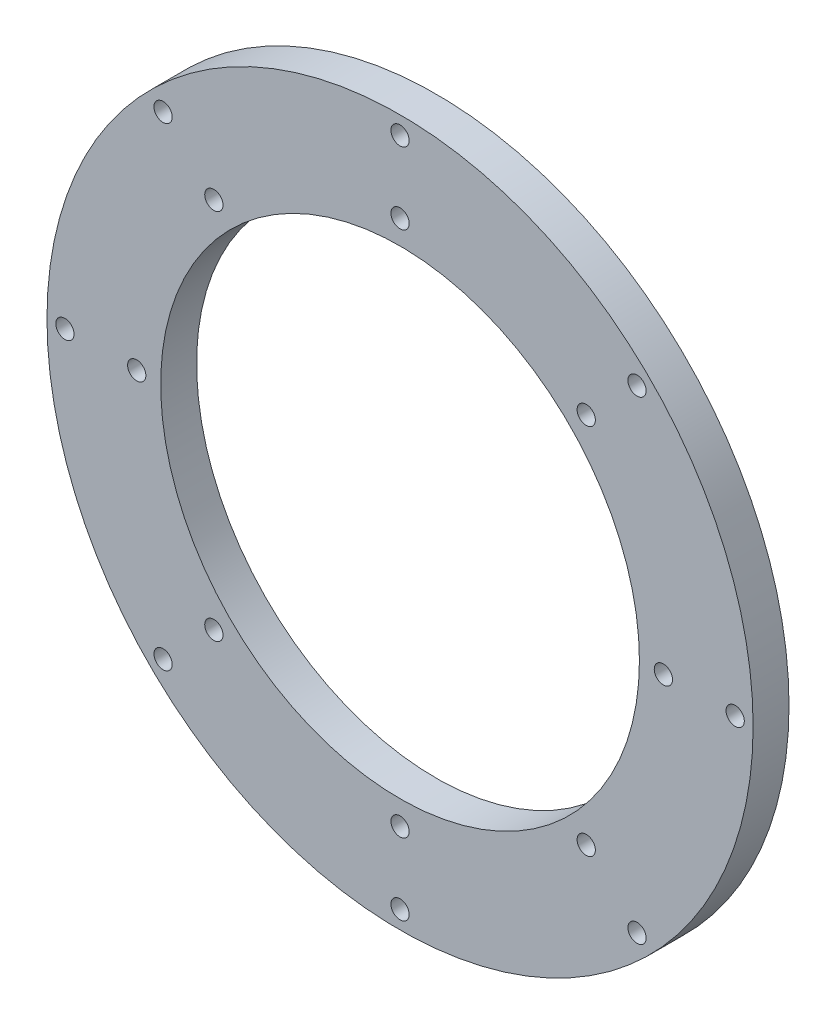
ISO-10303-21;
HEADER;
FILE_DESCRIPTION(('STEP AP214'),'2;1');
FILE_NAME('part.step','',(''),(''),'','','');
FILE_SCHEMA(('AUTOMOTIVE_DESIGN { 1 0 10303 214 1 1 1 1 }'));
ENDSEC;
DATA;
#1=APPLICATION_CONTEXT('core data for automotive mechanical design processes');
#2=APPLICATION_PROTOCOL_DEFINITION('international standard','automotive_design',2000,#1);
#3=PRODUCT_CONTEXT('',#1,'mechanical');
#4=PRODUCT('Part','Part','',(#3));
#5=PRODUCT_RELATED_PRODUCT_CATEGORY('part','',(#4));
#6=PRODUCT_DEFINITION_FORMATION('','',#4);
#7=PRODUCT_DEFINITION_CONTEXT('part definition',#1,'design');
#8=PRODUCT_DEFINITION('design','',#6,#7);
#9=PRODUCT_DEFINITION_SHAPE('','',#8);
#10=(LENGTH_UNIT() NAMED_UNIT(*) SI_UNIT(.MILLI.,.METRE.));
#11=(NAMED_UNIT(*) PLANE_ANGLE_UNIT() SI_UNIT($,.RADIAN.));
#12=(NAMED_UNIT(*) SI_UNIT($,.STERADIAN.) SOLID_ANGLE_UNIT());
#13=UNCERTAINTY_MEASURE_WITH_UNIT(LENGTH_MEASURE(1.E-05),#10,'distance_accuracy_value','');
#14=(GEOMETRIC_REPRESENTATION_CONTEXT(3) GLOBAL_UNCERTAINTY_ASSIGNED_CONTEXT((#13)) GLOBAL_UNIT_ASSIGNED_CONTEXT((#10,
#11,#12)) REPRESENTATION_CONTEXT('',''));
#15=CARTESIAN_POINT('',(0.,0.,0.));
#16=DIRECTION('',(0.,0.,1.));
#17=DIRECTION('',(1.,0.,0.));
#18=AXIS2_PLACEMENT_3D('',#15,#16,#17);
#19=CARTESIAN_POINT('',(0.,0.,0.));
#20=DIRECTION('',(0.,0.,1.));
#21=DIRECTION('',(1.,0.,0.));
#22=AXIS2_PLACEMENT_3D('',#19,#20,#21);
#23=PLANE('',#22);
#24=CARTESIAN_POINT('',(-31.1126983722077,31.1126983722085,0.));
#25=DIRECTION('',(0.,0.,-1.));
#26=DIRECTION('',(-1.,0.,0.));
#27=AXIS2_PLACEMENT_3D('',#24,#25,#26);
#28=CIRCLE('',#27,3.3);
#29=CARTESIAN_POINT('',(-34.4126983722077,31.1126983722085,0.));
#30=VERTEX_POINT('',#29);
#31=EDGE_CURVE('E169',#30,#30,#28,.T.);
#32=ORIENTED_EDGE('',*,*,#31,.F.);
#33=EDGE_LOOP('',(#32));
#34=FACE_BOUND('',#33,.T.);
#35=CARTESIAN_POINT('',(-44.,4.60875536727294E-13,0.));
#36=DIRECTION('',(0.,0.,-1.));
#37=DIRECTION('',(-1.,0.,0.));
#38=AXIS2_PLACEMENT_3D('',#35,#36,#37);
#39=CIRCLE('',#38,3.3);
#40=CARTESIAN_POINT('',(-47.3,4.60875536727294E-13,0.));
#41=VERTEX_POINT('',#40);
#42=EDGE_CURVE('E163',#41,#41,#39,.T.);
#43=ORIENTED_EDGE('',*,*,#42,.F.);
#44=EDGE_LOOP('',(#43));
#45=FACE_BOUND('',#44,.T.);
#46=CARTESIAN_POINT('',(0.,44.,0.));
#47=DIRECTION('',(0.,0.,-1.));
#48=DIRECTION('',(-1.,0.,0.));
#49=AXIS2_PLACEMENT_3D('',#46,#47,#48);
#50=CIRCLE('',#49,3.3);
#51=CARTESIAN_POINT('',(-3.3,44.,0.));
#52=VERTEX_POINT('',#51);
#53=EDGE_CURVE('E127',#52,#52,#50,.T.);
#54=ORIENTED_EDGE('',*,*,#53,.F.);
#55=EDGE_LOOP('',(#54));
#56=FACE_BOUND('',#55,.T.);
#57=CARTESIAN_POINT('',(0.,56.,0.));
#58=DIRECTION('',(0.,0.,1.));
#59=DIRECTION('',(1.,0.,0.));
#60=AXIS2_PLACEMENT_3D('',#57,#58,#59);
#61=CIRCLE('',#60,1.525);
#62=CARTESIAN_POINT('',(1.525,56.,0.));
#63=VERTEX_POINT('',#62);
#64=EDGE_CURVE('E45',#63,#63,#61,.T.);
#65=ORIENTED_EDGE('',*,*,#64,.T.);
#66=EDGE_LOOP('',(#65));
#67=FACE_BOUND('',#66,.T.);
#68=CARTESIAN_POINT('',(39.5979797464467,39.5979797464467,0.));
#69=DIRECTION('',(0.,0.,1.));
#70=DIRECTION('',(1.,0.,0.));
#71=AXIS2_PLACEMENT_3D('',#68,#69,#70);
#72=CIRCLE('',#71,1.525);
#73=CARTESIAN_POINT('',(41.1229797464467,39.5979797464467,0.));
#74=VERTEX_POINT('',#73);
#75=EDGE_CURVE('E87',#74,#74,#72,.T.);
#76=ORIENTED_EDGE('',*,*,#75,.T.);
#77=EDGE_LOOP('',(#76));
#78=FACE_BOUND('',#77,.T.);
#79=CARTESIAN_POINT('',(56.,0.,0.));
#80=DIRECTION('',(0.,0.,1.));
#81=DIRECTION('',(1.,0.,0.));
#82=AXIS2_PLACEMENT_3D('',#79,#80,#81);
#83=CIRCLE('',#82,1.525);
#84=CARTESIAN_POINT('',(57.525,0.,0.));
#85=VERTEX_POINT('',#84);
#86=EDGE_CURVE('E81',#85,#85,#83,.T.);
#87=ORIENTED_EDGE('',*,*,#86,.T.);
#88=EDGE_LOOP('',(#87));
#89=FACE_BOUND('',#88,.T.);
#90=CARTESIAN_POINT('',(39.5979797464467,-39.5979797464467,0.));
#91=DIRECTION('',(0.,0.,1.));
#92=DIRECTION('',(1.,0.,0.));
#93=AXIS2_PLACEMENT_3D('',#90,#91,#92);
#94=CIRCLE('',#93,1.525);
#95=CARTESIAN_POINT('',(41.1229797464467,-39.5979797464467,0.));
#96=VERTEX_POINT('',#95);
#97=EDGE_CURVE('E75',#96,#96,#94,.T.);
#98=ORIENTED_EDGE('',*,*,#97,.T.);
#99=EDGE_LOOP('',(#98));
#100=FACE_BOUND('',#99,.T.);
#101=CARTESIAN_POINT('',(0.,-56.,0.));
#102=DIRECTION('',(0.,0.,1.));
#103=DIRECTION('',(1.,0.,0.));
#104=AXIS2_PLACEMENT_3D('',#101,#102,#103);
#105=CIRCLE('',#104,1.525);
#106=CARTESIAN_POINT('',(1.52500000000001,-56.,0.));
#107=VERTEX_POINT('',#106);
#108=EDGE_CURVE('E69',#107,#107,#105,.T.);
#109=ORIENTED_EDGE('',*,*,#108,.T.);
#110=EDGE_LOOP('',(#109));
#111=FACE_BOUND('',#110,.T.);
#112=CARTESIAN_POINT('',(-39.5979797464467,-39.5979797464467,0.));
#113=DIRECTION('',(0.,0.,1.));
#114=DIRECTION('',(1.,0.,0.));
#115=AXIS2_PLACEMENT_3D('',#112,#113,#114);
#116=CIRCLE('',#115,1.52499999999999);
#117=CARTESIAN_POINT('',(-38.0729797464467,-39.5979797464467,0.));
#118=VERTEX_POINT('',#117);
#119=EDGE_CURVE('E63',#118,#118,#116,.T.);
#120=ORIENTED_EDGE('',*,*,#119,.T.);
#121=EDGE_LOOP('',(#120));
#122=FACE_BOUND('',#121,.T.);
#123=CARTESIAN_POINT('',(-56.,0.,0.));
#124=DIRECTION('',(0.,0.,1.));
#125=DIRECTION('',(1.,0.,0.));
#126=AXIS2_PLACEMENT_3D('',#123,#124,#125);
#127=CIRCLE('',#126,1.525);
#128=CARTESIAN_POINT('',(-54.475,0.,0.));
#129=VERTEX_POINT('',#128);
#130=EDGE_CURVE('E57',#129,#129,#127,.T.);
#131=ORIENTED_EDGE('',*,*,#130,.T.);
#132=EDGE_LOOP('',(#131));
#133=FACE_BOUND('',#132,.T.);
#134=CARTESIAN_POINT('',(-39.5979797464467,39.5979797464467,0.));
#135=DIRECTION('',(0.,0.,1.));
#136=DIRECTION('',(1.,0.,0.));
#137=AXIS2_PLACEMENT_3D('',#134,#135,#136);
#138=CIRCLE('',#137,1.525);
#139=CARTESIAN_POINT('',(-38.0729797464467,39.5979797464467,0.));
#140=VERTEX_POINT('',#139);
#141=EDGE_CURVE('E50',#140,#140,#138,.T.);
#142=ORIENTED_EDGE('',*,*,#141,.T.);
#143=EDGE_LOOP('',(#142));
#144=FACE_BOUND('',#143,.T.);
#145=CARTESIAN_POINT('',(0.,0.,0.));
#146=DIRECTION('',(0.,0.,1.));
#147=DIRECTION('',(1.,0.,0.));
#148=AXIS2_PLACEMENT_3D('',#145,#146,#147);
#149=CIRCLE('',#148,59.);
#150=CARTESIAN_POINT('',(59.,0.,0.));
#151=VERTEX_POINT('',#150);
#152=EDGE_CURVE('E38',#151,#151,#149,.T.);
#153=ORIENTED_EDGE('',*,*,#152,.F.);
#154=EDGE_LOOP('',(#153));
#155=FACE_BOUND('',#154,.T.);
#156=CARTESIAN_POINT('',(0.,0.,0.));
#157=DIRECTION('',(0.,0.,1.));
#158=DIRECTION('',(1.,0.,0.));
#159=AXIS2_PLACEMENT_3D('',#156,#157,#158);
#160=CIRCLE('',#159,40.);
#161=CARTESIAN_POINT('',(40.,0.,0.));
#162=VERTEX_POINT('',#161);
#163=EDGE_CURVE('E51',#162,#162,#160,.F.);
#164=ORIENTED_EDGE('',*,*,#163,.F.);
#165=EDGE_LOOP('',(#164));
#166=FACE_BOUND('',#165,.T.);
#167=CARTESIAN_POINT('',(31.1126983722081,31.112698372208,0.));
#168=DIRECTION('',(0.,0.,-1.));
#169=DIRECTION('',(-1.,0.,0.));
#170=AXIS2_PLACEMENT_3D('',#167,#168,#169);
#171=CIRCLE('',#170,3.3);
#172=CARTESIAN_POINT('',(27.8126983722081,31.112698372208,0.));
#173=VERTEX_POINT('',#172);
#174=EDGE_CURVE('E133',#173,#173,#171,.T.);
#175=ORIENTED_EDGE('',*,*,#174,.F.);
#176=EDGE_LOOP('',(#175));
#177=FACE_BOUND('',#176,.T.);
#178=CARTESIAN_POINT('',(44.,-1.53625178909098E-13,0.));
#179=DIRECTION('',(0.,0.,-1.));
#180=DIRECTION('',(-1.,0.,0.));
#181=AXIS2_PLACEMENT_3D('',#178,#179,#180);
#182=CIRCLE('',#181,3.3);
#183=CARTESIAN_POINT('',(40.7,-1.53625178909098E-13,0.));
#184=VERTEX_POINT('',#183);
#185=EDGE_CURVE('E139',#184,#184,#182,.T.);
#186=ORIENTED_EDGE('',*,*,#185,.F.);
#187=EDGE_LOOP('',(#186));
#188=FACE_BOUND('',#187,.T.);
#189=CARTESIAN_POINT('',(31.1126983722079,-31.1126983722082,0.));
#190=DIRECTION('',(0.,0.,-1.));
#191=DIRECTION('',(-1.,0.,0.));
#192=AXIS2_PLACEMENT_3D('',#189,#190,#191);
#193=CIRCLE('',#192,3.3);
#194=CARTESIAN_POINT('',(27.8126983722079,-31.1126983722082,0.));
#195=VERTEX_POINT('',#194);
#196=EDGE_CURVE('E145',#195,#195,#193,.T.);
#197=ORIENTED_EDGE('',*,*,#196,.F.);
#198=EDGE_LOOP('',(#197));
#199=FACE_BOUND('',#198,.T.);
#200=CARTESIAN_POINT('',(0.,-44.,0.));
#201=DIRECTION('',(0.,0.,-1.));
#202=DIRECTION('',(-1.,0.,0.));
#203=AXIS2_PLACEMENT_3D('',#200,#201,#202);
#204=CIRCLE('',#203,3.3);
#205=CARTESIAN_POINT('',(-3.3,-44.,0.));
#206=VERTEX_POINT('',#205);
#207=EDGE_CURVE('E151',#206,#206,#204,.T.);
#208=ORIENTED_EDGE('',*,*,#207,.F.);
#209=EDGE_LOOP('',(#208));
#210=FACE_BOUND('',#209,.T.);
#211=CARTESIAN_POINT('',(-31.1126983722084,-31.1126983722078,0.));
#212=DIRECTION('',(0.,0.,-1.));
#213=DIRECTION('',(-1.,0.,0.));
#214=AXIS2_PLACEMENT_3D('',#211,#212,#213);
#215=CIRCLE('',#214,3.3);
#216=CARTESIAN_POINT('',(-34.4126983722084,-31.1126983722078,0.));
#217=VERTEX_POINT('',#216);
#218=EDGE_CURVE('E157',#217,#217,#215,.T.);
#219=ORIENTED_EDGE('',*,*,#218,.F.);
#220=EDGE_LOOP('',(#219));
#221=FACE_BOUND('',#220,.T.);
#222=ADVANCED_FACE('F34',(#34,#45,#56,#67,#78,#89,#100,#111,#122,#133,#144,#155,#166,#177,#188,
#199,#210,#221),#23,.F.);
#223=CARTESIAN_POINT('',(0.,0.,6.));
#224=DIRECTION('',(0.,0.,1.));
#225=DIRECTION('',(1.,0.,0.));
#226=AXIS2_PLACEMENT_3D('',#223,#224,#225);
#227=PLANE('',#226);
#228=CARTESIAN_POINT('',(0.,44.,6.));
#229=DIRECTION('',(0.,0.,1.));
#230=DIRECTION('',(1.,0.,0.));
#231=AXIS2_PLACEMENT_3D('',#228,#229,#230);
#232=CIRCLE('',#231,1.525);
#233=CARTESIAN_POINT('',(1.525,44.,6.));
#234=VERTEX_POINT('',#233);
#235=EDGE_CURVE('E100',#234,#234,#232,.F.);
#236=ORIENTED_EDGE('',*,*,#235,.T.);
#237=EDGE_LOOP('',(#236));
#238=FACE_BOUND('',#237,.T.);
#239=CARTESIAN_POINT('',(-31.1126983722081,31.1126983722081,6.));
#240=DIRECTION('',(0.,0.,1.));
#241=DIRECTION('',(1.,0.,0.));
#242=AXIS2_PLACEMENT_3D('',#239,#240,#241);
#243=CIRCLE('',#242,1.52499999999999);
#244=CARTESIAN_POINT('',(-29.5876983722081,31.1126983722081,6.));
#245=VERTEX_POINT('',#244);
#246=EDGE_CURVE('E120',#245,#245,#243,.F.);
#247=ORIENTED_EDGE('',*,*,#246,.T.);
#248=EDGE_LOOP('',(#247));
#249=FACE_BOUND('',#248,.T.);
#250=CARTESIAN_POINT('',(-44.,0.,6.));
#251=DIRECTION('',(0.,0.,1.));
#252=DIRECTION('',(1.,0.,0.));
#253=AXIS2_PLACEMENT_3D('',#250,#251,#252);
#254=CIRCLE('',#253,1.525);
#255=CARTESIAN_POINT('',(-42.475,0.,6.));
#256=VERTEX_POINT('',#255);
#257=EDGE_CURVE('E117',#256,#256,#254,.F.);
#258=ORIENTED_EDGE('',*,*,#257,.T.);
#259=EDGE_LOOP('',(#258));
#260=FACE_BOUND('',#259,.T.);
#261=CARTESIAN_POINT('',(-31.1126983722081,-31.1126983722081,6.));
#262=DIRECTION('',(0.,0.,1.));
#263=DIRECTION('',(1.,0.,0.));
#264=AXIS2_PLACEMENT_3D('',#261,#262,#263);
#265=CIRCLE('',#264,1.525);
#266=CARTESIAN_POINT('',(-29.5876983722081,-31.1126983722081,6.));
#267=VERTEX_POINT('',#266);
#268=EDGE_CURVE('E114',#267,#267,#265,.F.);
#269=ORIENTED_EDGE('',*,*,#268,.T.);
#270=EDGE_LOOP('',(#269));
#271=FACE_BOUND('',#270,.T.);
#272=CARTESIAN_POINT('',(0.,-44.,6.));
#273=DIRECTION('',(0.,0.,1.));
#274=DIRECTION('',(1.,0.,0.));
#275=AXIS2_PLACEMENT_3D('',#272,#273,#274);
#276=CIRCLE('',#275,1.525);
#277=CARTESIAN_POINT('',(1.52499999999999,-44.,6.));
#278=VERTEX_POINT('',#277);
#279=EDGE_CURVE('E111',#278,#278,#276,.F.);
#280=ORIENTED_EDGE('',*,*,#279,.T.);
#281=EDGE_LOOP('',(#280));
#282=FACE_BOUND('',#281,.T.);
#283=CARTESIAN_POINT('',(31.1126983722081,-31.1126983722081,6.));
#284=DIRECTION('',(0.,0.,1.));
#285=DIRECTION('',(1.,0.,0.));
#286=AXIS2_PLACEMENT_3D('',#283,#284,#285);
#287=CIRCLE('',#286,1.525);
#288=CARTESIAN_POINT('',(32.6376983722081,-31.1126983722081,6.));
#289=VERTEX_POINT('',#288);
#290=EDGE_CURVE('E108',#289,#289,#287,.F.);
#291=ORIENTED_EDGE('',*,*,#290,.T.);
#292=EDGE_LOOP('',(#291));
#293=FACE_BOUND('',#292,.T.);
#294=CARTESIAN_POINT('',(44.,0.,6.));
#295=DIRECTION('',(0.,0.,1.));
#296=DIRECTION('',(1.,0.,0.));
#297=AXIS2_PLACEMENT_3D('',#294,#295,#296);
#298=CIRCLE('',#297,1.525);
#299=CARTESIAN_POINT('',(45.525,0.,6.));
#300=VERTEX_POINT('',#299);
#301=EDGE_CURVE('E104',#300,#300,#298,.F.);
#302=ORIENTED_EDGE('',*,*,#301,.T.);
#303=EDGE_LOOP('',(#302));
#304=FACE_BOUND('',#303,.T.);
#305=CARTESIAN_POINT('',(31.1126983722081,31.1126983722081,6.));
#306=DIRECTION('',(0.,0.,1.));
#307=DIRECTION('',(1.,0.,0.));
#308=AXIS2_PLACEMENT_3D('',#305,#306,#307);
#309=CIRCLE('',#308,1.525);
#310=CARTESIAN_POINT('',(32.6376983722081,31.1126983722081,6.));
#311=VERTEX_POINT('',#310);
#312=EDGE_CURVE('E101',#311,#311,#309,.F.);
#313=ORIENTED_EDGE('',*,*,#312,.T.);
#314=EDGE_LOOP('',(#313));
#315=FACE_BOUND('',#314,.T.);
#316=CARTESIAN_POINT('',(0.,56.,6.));
#317=DIRECTION('',(0.,0.,1.));
#318=DIRECTION('',(1.,0.,0.));
#319=AXIS2_PLACEMENT_3D('',#316,#317,#318);
#320=CIRCLE('',#319,1.525);
#321=CARTESIAN_POINT('',(1.525,56.,6.));
#322=VERTEX_POINT('',#321);
#323=EDGE_CURVE('E90',#322,#322,#320,.T.);
#324=ORIENTED_EDGE('',*,*,#323,.F.);
#325=EDGE_LOOP('',(#324));
#326=FACE_BOUND('',#325,.T.);
#327=CARTESIAN_POINT('',(39.5979797464467,39.5979797464467,6.));
#328=DIRECTION('',(0.,0.,1.));
#329=DIRECTION('',(1.,0.,0.));
#330=AXIS2_PLACEMENT_3D('',#327,#328,#329);
#331=CIRCLE('',#330,1.525);
#332=CARTESIAN_POINT('',(41.1229797464467,39.5979797464467,6.));
#333=VERTEX_POINT('',#332);
#334=EDGE_CURVE('E84',#333,#333,#331,.T.);
#335=ORIENTED_EDGE('',*,*,#334,.F.);
#336=EDGE_LOOP('',(#335));
#337=FACE_BOUND('',#336,.T.);
#338=CARTESIAN_POINT('',(56.,0.,6.));
#339=DIRECTION('',(0.,0.,1.));
#340=DIRECTION('',(1.,0.,0.));
#341=AXIS2_PLACEMENT_3D('',#338,#339,#340);
#342=CIRCLE('',#341,1.525);
#343=CARTESIAN_POINT('',(57.525,0.,6.));
#344=VERTEX_POINT('',#343);
#345=EDGE_CURVE('E78',#344,#344,#342,.T.);
#346=ORIENTED_EDGE('',*,*,#345,.F.);
#347=EDGE_LOOP('',(#346));
#348=FACE_BOUND('',#347,.T.);
#349=CARTESIAN_POINT('',(39.5979797464467,-39.5979797464467,6.));
#350=DIRECTION('',(0.,0.,1.));
#351=DIRECTION('',(1.,0.,0.));
#352=AXIS2_PLACEMENT_3D('',#349,#350,#351);
#353=CIRCLE('',#352,1.525);
#354=CARTESIAN_POINT('',(41.1229797464467,-39.5979797464467,6.));
#355=VERTEX_POINT('',#354);
#356=EDGE_CURVE('E72',#355,#355,#353,.T.);
#357=ORIENTED_EDGE('',*,*,#356,.F.);
#358=EDGE_LOOP('',(#357));
#359=FACE_BOUND('',#358,.T.);
#360=CARTESIAN_POINT('',(0.,-56.,6.));
#361=DIRECTION('',(0.,0.,1.));
#362=DIRECTION('',(1.,0.,0.));
#363=AXIS2_PLACEMENT_3D('',#360,#361,#362);
#364=CIRCLE('',#363,1.525);
#365=CARTESIAN_POINT('',(1.52500000000001,-56.,6.));
#366=VERTEX_POINT('',#365);
#367=EDGE_CURVE('E66',#366,#366,#364,.T.);
#368=ORIENTED_EDGE('',*,*,#367,.F.);
#369=EDGE_LOOP('',(#368));
#370=FACE_BOUND('',#369,.T.);
#371=CARTESIAN_POINT('',(-39.5979797464467,-39.5979797464467,6.));
#372=DIRECTION('',(0.,0.,1.));
#373=DIRECTION('',(1.,0.,0.));
#374=AXIS2_PLACEMENT_3D('',#371,#372,#373);
#375=CIRCLE('',#374,1.52499999999999);
#376=CARTESIAN_POINT('',(-38.0729797464467,-39.5979797464467,6.));
#377=VERTEX_POINT('',#376);
#378=EDGE_CURVE('E60',#377,#377,#375,.T.);
#379=ORIENTED_EDGE('',*,*,#378,.F.);
#380=EDGE_LOOP('',(#379));
#381=FACE_BOUND('',#380,.T.);
#382=CARTESIAN_POINT('',(-56.,0.,6.));
#383=DIRECTION('',(0.,0.,1.));
#384=DIRECTION('',(1.,0.,0.));
#385=AXIS2_PLACEMENT_3D('',#382,#383,#384);
#386=CIRCLE('',#385,1.525);
#387=CARTESIAN_POINT('',(-54.475,0.,6.));
#388=VERTEX_POINT('',#387);
#389=EDGE_CURVE('E54',#388,#388,#386,.T.);
#390=ORIENTED_EDGE('',*,*,#389,.F.);
#391=EDGE_LOOP('',(#390));
#392=FACE_BOUND('',#391,.T.);
#393=CARTESIAN_POINT('',(-39.5979797464467,39.5979797464467,6.));
#394=DIRECTION('',(0.,0.,1.));
#395=DIRECTION('',(1.,0.,0.));
#396=AXIS2_PLACEMENT_3D('',#393,#394,#395);
#397=CIRCLE('',#396,1.525);
#398=CARTESIAN_POINT('',(-38.0729797464467,39.5979797464467,6.));
#399=VERTEX_POINT('',#398);
#400=EDGE_CURVE('E47',#399,#399,#397,.T.);
#401=ORIENTED_EDGE('',*,*,#400,.F.);
#402=EDGE_LOOP('',(#401));
#403=FACE_BOUND('',#402,.T.);
#404=CARTESIAN_POINT('',(0.,0.,6.));
#405=DIRECTION('',(0.,0.,1.));
#406=DIRECTION('',(1.,0.,0.));
#407=AXIS2_PLACEMENT_3D('',#404,#405,#406);
#408=CIRCLE('',#407,59.);
#409=CARTESIAN_POINT('',(59.,0.,6.));
#410=VERTEX_POINT('',#409);
#411=EDGE_CURVE('E10',#410,#410,#408,.T.);
#412=ORIENTED_EDGE('',*,*,#411,.T.);
#413=EDGE_LOOP('',(#412));
#414=FACE_BOUND('',#413,.T.);
#415=CARTESIAN_POINT('',(0.,0.,6.));
#416=DIRECTION('',(0.,0.,1.));
#417=DIRECTION('',(1.,0.,0.));
#418=AXIS2_PLACEMENT_3D('',#415,#416,#417);
#419=CIRCLE('',#418,40.);
#420=CARTESIAN_POINT('',(40.,0.,6.));
#421=VERTEX_POINT('',#420);
#422=EDGE_CURVE('E97',#421,#421,#419,.T.);
#423=ORIENTED_EDGE('',*,*,#422,.F.);
#424=EDGE_LOOP('',(#423));
#425=FACE_BOUND('',#424,.T.);
#426=ADVANCED_FACE('F177',(#238,#249,#260,#271,#282,#293,#304,#315,#326,#337,#348,#359,#370,
#381,#392,#403,#414,#425),#227,.T.);
#427=CARTESIAN_POINT('',(0.,0.,6.));
#428=DIRECTION('',(0.,0.,-1.));
#429=DIRECTION('',(-1.,0.,0.));
#430=AXIS2_PLACEMENT_3D('',#427,#428,#429);
#431=CYLINDRICAL_SURFACE('',#430,59.);
#432=ORIENTED_EDGE('',*,*,#411,.F.);
#433=EDGE_LOOP('',(#432));
#434=FACE_BOUND('',#433,.T.);
#435=ORIENTED_EDGE('',*,*,#152,.T.);
#436=EDGE_LOOP('',(#435));
#437=FACE_BOUND('',#436,.T.);
#438=ADVANCED_FACE('F36',(#434,#437),#431,.T.);
#439=CARTESIAN_POINT('',(-39.5979797464467,39.5979797464467,0.));
#440=DIRECTION('',(0.,0.,1.));
#441=DIRECTION('',(1.,0.,0.));
#442=AXIS2_PLACEMENT_3D('',#439,#440,#441);
#443=CYLINDRICAL_SURFACE('',#442,1.525);
#444=ORIENTED_EDGE('',*,*,#141,.F.);
#445=EDGE_LOOP('',(#444));
#446=FACE_BOUND('',#445,.T.);
#447=ORIENTED_EDGE('',*,*,#400,.T.);
#448=EDGE_LOOP('',(#447));
#449=FACE_BOUND('',#448,.T.);
#450=ADVANCED_FACE('F308',(#446,#449),#443,.F.);
#451=CARTESIAN_POINT('',(-56.,0.,0.));
#452=DIRECTION('',(0.,0.,1.));
#453=DIRECTION('',(1.,0.,0.));
#454=AXIS2_PLACEMENT_3D('',#451,#452,#453);
#455=CYLINDRICAL_SURFACE('',#454,1.525);
#456=ORIENTED_EDGE('',*,*,#130,.F.);
#457=EDGE_LOOP('',(#456));
#458=FACE_BOUND('',#457,.T.);
#459=ORIENTED_EDGE('',*,*,#389,.T.);
#460=EDGE_LOOP('',(#459));
#461=FACE_BOUND('',#460,.T.);
#462=ADVANCED_FACE('F304',(#458,#461),#455,.F.);
#463=CARTESIAN_POINT('',(-39.5979797464467,-39.5979797464467,0.));
#464=DIRECTION('',(0.,0.,1.));
#465=DIRECTION('',(1.,0.,0.));
#466=AXIS2_PLACEMENT_3D('',#463,#464,#465);
#467=CYLINDRICAL_SURFACE('',#466,1.52499999999999);
#468=ORIENTED_EDGE('',*,*,#119,.F.);
#469=EDGE_LOOP('',(#468));
#470=FACE_BOUND('',#469,.T.);
#471=ORIENTED_EDGE('',*,*,#378,.T.);
#472=EDGE_LOOP('',(#471));
#473=FACE_BOUND('',#472,.T.);
#474=ADVANCED_FACE('F300',(#470,#473),#467,.F.);
#475=CARTESIAN_POINT('',(0.,-56.,0.));
#476=DIRECTION('',(0.,0.,1.));
#477=DIRECTION('',(1.,0.,0.));
#478=AXIS2_PLACEMENT_3D('',#475,#476,#477);
#479=CYLINDRICAL_SURFACE('',#478,1.525);
#480=ORIENTED_EDGE('',*,*,#108,.F.);
#481=EDGE_LOOP('',(#480));
#482=FACE_BOUND('',#481,.T.);
#483=ORIENTED_EDGE('',*,*,#367,.T.);
#484=EDGE_LOOP('',(#483));
#485=FACE_BOUND('',#484,.T.);
#486=ADVANCED_FACE('F296',(#482,#485),#479,.F.);
#487=CARTESIAN_POINT('',(39.5979797464467,-39.5979797464467,0.));
#488=DIRECTION('',(0.,0.,1.));
#489=DIRECTION('',(1.,0.,0.));
#490=AXIS2_PLACEMENT_3D('',#487,#488,#489);
#491=CYLINDRICAL_SURFACE('',#490,1.525);
#492=ORIENTED_EDGE('',*,*,#97,.F.);
#493=EDGE_LOOP('',(#492));
#494=FACE_BOUND('',#493,.T.);
#495=ORIENTED_EDGE('',*,*,#356,.T.);
#496=EDGE_LOOP('',(#495));
#497=FACE_BOUND('',#496,.T.);
#498=ADVANCED_FACE('F292',(#494,#497),#491,.F.);
#499=CARTESIAN_POINT('',(56.,0.,0.));
#500=DIRECTION('',(0.,0.,1.));
#501=DIRECTION('',(1.,0.,0.));
#502=AXIS2_PLACEMENT_3D('',#499,#500,#501);
#503=CYLINDRICAL_SURFACE('',#502,1.525);
#504=ORIENTED_EDGE('',*,*,#86,.F.);
#505=EDGE_LOOP('',(#504));
#506=FACE_BOUND('',#505,.T.);
#507=ORIENTED_EDGE('',*,*,#345,.T.);
#508=EDGE_LOOP('',(#507));
#509=FACE_BOUND('',#508,.T.);
#510=ADVANCED_FACE('F288',(#506,#509),#503,.F.);
#511=CARTESIAN_POINT('',(39.5979797464467,39.5979797464467,0.));
#512=DIRECTION('',(0.,0.,1.));
#513=DIRECTION('',(1.,0.,0.));
#514=AXIS2_PLACEMENT_3D('',#511,#512,#513);
#515=CYLINDRICAL_SURFACE('',#514,1.525);
#516=ORIENTED_EDGE('',*,*,#75,.F.);
#517=EDGE_LOOP('',(#516));
#518=FACE_BOUND('',#517,.T.);
#519=ORIENTED_EDGE('',*,*,#334,.T.);
#520=EDGE_LOOP('',(#519));
#521=FACE_BOUND('',#520,.T.);
#522=ADVANCED_FACE('F284',(#518,#521),#515,.F.);
#523=CARTESIAN_POINT('',(0.,56.,0.));
#524=DIRECTION('',(0.,0.,1.));
#525=DIRECTION('',(1.,0.,0.));
#526=AXIS2_PLACEMENT_3D('',#523,#524,#525);
#527=CYLINDRICAL_SURFACE('',#526,1.525);
#528=ORIENTED_EDGE('',*,*,#64,.F.);
#529=EDGE_LOOP('',(#528));
#530=FACE_BOUND('',#529,.T.);
#531=ORIENTED_EDGE('',*,*,#323,.T.);
#532=EDGE_LOOP('',(#531));
#533=FACE_BOUND('',#532,.T.);
#534=ADVANCED_FACE('F280',(#530,#533),#527,.F.);
#535=CARTESIAN_POINT('',(0.,0.,-142.835569799683));
#536=DIRECTION('',(0.,0.,1.));
#537=DIRECTION('',(1.,0.,0.));
#538=AXIS2_PLACEMENT_3D('',#535,#536,#537);
#539=CYLINDRICAL_SURFACE('',#538,40.);
#540=ORIENTED_EDGE('',*,*,#163,.T.);
#541=EDGE_LOOP('',(#540));
#542=FACE_BOUND('',#541,.T.);
#543=ORIENTED_EDGE('',*,*,#422,.T.);
#544=EDGE_LOOP('',(#543));
#545=FACE_BOUND('',#544,.T.);
#546=ADVANCED_FACE('F276',(#542,#545),#539,.F.);
#547=CARTESIAN_POINT('',(31.1126983722081,31.1126983722081,10.3133513652379));
#548=DIRECTION('',(0.,0.,-1.));
#549=DIRECTION('',(-1.,0.,0.));
#550=AXIS2_PLACEMENT_3D('',#547,#548,#549);
#551=CYLINDRICAL_SURFACE('',#550,1.525);
#552=CARTESIAN_POINT('',(31.1126983722081,31.112698372208,1.775));
#553=DIRECTION('',(0.,0.,-1.));
#554=DIRECTION('',(-1.,0.,0.));
#555=AXIS2_PLACEMENT_3D('',#552,#553,#554);
#556=CIRCLE('',#555,1.52499999999999);
#557=CARTESIAN_POINT('',(29.5876983722082,31.112698372208,1.775));
#558=VERTEX_POINT('',#557);
#559=EDGE_CURVE('E130',#558,#558,#556,.T.);
#560=ORIENTED_EDGE('',*,*,#559,.T.);
#561=EDGE_LOOP('',(#560));
#562=FACE_BOUND('',#561,.T.);
#563=ORIENTED_EDGE('',*,*,#312,.F.);
#564=EDGE_LOOP('',(#563));
#565=FACE_BOUND('',#564,.T.);
#566=ADVANCED_FACE('F272',(#562,#565),#551,.F.);
#567=CARTESIAN_POINT('',(44.,0.,10.3133513652379));
#568=DIRECTION('',(0.,0.,-1.));
#569=DIRECTION('',(-1.,0.,0.));
#570=AXIS2_PLACEMENT_3D('',#567,#568,#569);
#571=CYLINDRICAL_SURFACE('',#570,1.525);
#572=CARTESIAN_POINT('',(44.,-1.53625178909098E-13,1.775));
#573=DIRECTION('',(0.,0.,-1.));
#574=DIRECTION('',(-1.,0.,0.));
#575=AXIS2_PLACEMENT_3D('',#572,#573,#574);
#576=CIRCLE('',#575,1.52499999999998);
#577=CARTESIAN_POINT('',(42.475,-1.53625178909098E-13,1.775));
#578=VERTEX_POINT('',#577);
#579=EDGE_CURVE('E136',#578,#578,#576,.T.);
#580=ORIENTED_EDGE('',*,*,#579,.T.);
#581=EDGE_LOOP('',(#580));
#582=FACE_BOUND('',#581,.T.);
#583=ORIENTED_EDGE('',*,*,#301,.F.);
#584=EDGE_LOOP('',(#583));
#585=FACE_BOUND('',#584,.T.);
#586=ADVANCED_FACE('F268',(#582,#585),#571,.F.);
#587=CARTESIAN_POINT('',(31.1126983722081,-31.1126983722081,10.3133513652379));
#588=DIRECTION('',(0.,0.,-1.));
#589=DIRECTION('',(-1.,0.,0.));
#590=AXIS2_PLACEMENT_3D('',#587,#588,#589);
#591=CYLINDRICAL_SURFACE('',#590,1.525);
#592=CARTESIAN_POINT('',(31.1126983722079,-31.1126983722082,1.775));
#593=DIRECTION('',(0.,0.,-1.));
#594=DIRECTION('',(-1.,0.,0.));
#595=AXIS2_PLACEMENT_3D('',#592,#593,#594);
#596=CIRCLE('',#595,1.52499999999998);
#597=CARTESIAN_POINT('',(29.5876983722079,-31.1126983722082,1.775));
#598=VERTEX_POINT('',#597);
#599=EDGE_CURVE('E142',#598,#598,#596,.T.);
#600=ORIENTED_EDGE('',*,*,#599,.T.);
#601=EDGE_LOOP('',(#600));
#602=FACE_BOUND('',#601,.T.);
#603=ORIENTED_EDGE('',*,*,#290,.F.);
#604=EDGE_LOOP('',(#603));
#605=FACE_BOUND('',#604,.T.);
#606=ADVANCED_FACE('F264',(#602,#605),#591,.F.);
#607=CARTESIAN_POINT('',(0.,-44.,10.3133513652379));
#608=DIRECTION('',(0.,0.,-1.));
#609=DIRECTION('',(-1.,0.,0.));
#610=AXIS2_PLACEMENT_3D('',#607,#608,#609);
#611=CYLINDRICAL_SURFACE('',#610,1.525);
#612=CARTESIAN_POINT('',(0.,-44.,1.775));
#613=DIRECTION('',(0.,0.,-1.));
#614=DIRECTION('',(-1.,0.,0.));
#615=AXIS2_PLACEMENT_3D('',#612,#613,#614);
#616=CIRCLE('',#615,1.52499999999999);
#617=CARTESIAN_POINT('',(-1.52499999999999,-44.,1.775));
#618=VERTEX_POINT('',#617);
#619=EDGE_CURVE('E148',#618,#618,#616,.T.);
#620=ORIENTED_EDGE('',*,*,#619,.T.);
#621=EDGE_LOOP('',(#620));
#622=FACE_BOUND('',#621,.T.);
#623=ORIENTED_EDGE('',*,*,#279,.F.);
#624=EDGE_LOOP('',(#623));
#625=FACE_BOUND('',#624,.T.);
#626=ADVANCED_FACE('F260',(#622,#625),#611,.F.);
#627=CARTESIAN_POINT('',(-31.1126983722081,-31.1126983722081,10.3133513652379));
#628=DIRECTION('',(0.,0.,-1.));
#629=DIRECTION('',(-1.,0.,0.));
#630=AXIS2_PLACEMENT_3D('',#627,#628,#629);
#631=CYLINDRICAL_SURFACE('',#630,1.525);
#632=CARTESIAN_POINT('',(-31.1126983722084,-31.1126983722078,1.775));
#633=DIRECTION('',(0.,0.,-1.));
#634=DIRECTION('',(-1.,0.,0.));
#635=AXIS2_PLACEMENT_3D('',#632,#633,#634);
#636=CIRCLE('',#635,1.52499999999999);
#637=CARTESIAN_POINT('',(-32.6376983722083,-31.1126983722078,1.775));
#638=VERTEX_POINT('',#637);
#639=EDGE_CURVE('E154',#638,#638,#636,.T.);
#640=ORIENTED_EDGE('',*,*,#639,.T.);
#641=EDGE_LOOP('',(#640));
#642=FACE_BOUND('',#641,.T.);
#643=ORIENTED_EDGE('',*,*,#268,.F.);
#644=EDGE_LOOP('',(#643));
#645=FACE_BOUND('',#644,.T.);
#646=ADVANCED_FACE('F256',(#642,#645),#631,.F.);
#647=CARTESIAN_POINT('',(-44.,0.,10.3133513652379));
#648=DIRECTION('',(0.,0.,-1.));
#649=DIRECTION('',(-1.,0.,0.));
#650=AXIS2_PLACEMENT_3D('',#647,#648,#649);
#651=CYLINDRICAL_SURFACE('',#650,1.525);
#652=CARTESIAN_POINT('',(-44.,4.60875536727294E-13,1.775));
#653=DIRECTION('',(0.,0.,-1.));
#654=DIRECTION('',(-1.,0.,0.));
#655=AXIS2_PLACEMENT_3D('',#652,#653,#654);
#656=CIRCLE('',#655,1.52499999999998);
#657=CARTESIAN_POINT('',(-45.525,4.60875536727294E-13,1.775));
#658=VERTEX_POINT('',#657);
#659=EDGE_CURVE('E160',#658,#658,#656,.T.);
#660=ORIENTED_EDGE('',*,*,#659,.T.);
#661=EDGE_LOOP('',(#660));
#662=FACE_BOUND('',#661,.T.);
#663=ORIENTED_EDGE('',*,*,#257,.F.);
#664=EDGE_LOOP('',(#663));
#665=FACE_BOUND('',#664,.T.);
#666=ADVANCED_FACE('F252',(#662,#665),#651,.F.);
#667=CARTESIAN_POINT('',(-31.1126983722081,31.1126983722081,10.3133513652379));
#668=DIRECTION('',(0.,0.,-1.));
#669=DIRECTION('',(-1.,0.,0.));
#670=AXIS2_PLACEMENT_3D('',#667,#668,#669);
#671=CYLINDRICAL_SURFACE('',#670,1.52499999999999);
#672=CARTESIAN_POINT('',(-31.1126983722077,31.1126983722085,1.775));
#673=DIRECTION('',(0.,0.,-1.));
#674=DIRECTION('',(-1.,0.,0.));
#675=AXIS2_PLACEMENT_3D('',#672,#673,#674);
#676=CIRCLE('',#675,1.52499999999999);
#677=CARTESIAN_POINT('',(-32.6376983722077,31.1126983722085,1.775));
#678=VERTEX_POINT('',#677);
#679=EDGE_CURVE('E166',#678,#678,#676,.T.);
#680=ORIENTED_EDGE('',*,*,#679,.T.);
#681=EDGE_LOOP('',(#680));
#682=FACE_BOUND('',#681,.T.);
#683=ORIENTED_EDGE('',*,*,#246,.F.);
#684=EDGE_LOOP('',(#683));
#685=FACE_BOUND('',#684,.T.);
#686=ADVANCED_FACE('F248',(#682,#685),#671,.F.);
#687=CARTESIAN_POINT('',(0.,44.,10.3133513652379));
#688=DIRECTION('',(0.,0.,-1.));
#689=DIRECTION('',(-1.,0.,0.));
#690=AXIS2_PLACEMENT_3D('',#687,#688,#689);
#691=CYLINDRICAL_SURFACE('',#690,1.525);
#692=CARTESIAN_POINT('',(0.,44.,1.775));
#693=DIRECTION('',(0.,0.,-1.));
#694=DIRECTION('',(-1.,0.,0.));
#695=AXIS2_PLACEMENT_3D('',#692,#693,#694);
#696=CIRCLE('',#695,1.52499999999999);
#697=CARTESIAN_POINT('',(-1.52499999999999,44.,1.775));
#698=VERTEX_POINT('',#697);
#699=EDGE_CURVE('E105',#698,#698,#696,.T.);
#700=ORIENTED_EDGE('',*,*,#699,.T.);
#701=EDGE_LOOP('',(#700));
#702=FACE_BOUND('',#701,.T.);
#703=ORIENTED_EDGE('',*,*,#235,.F.);
#704=EDGE_LOOP('',(#703));
#705=FACE_BOUND('',#704,.T.);
#706=ADVANCED_FACE('F244',(#702,#705),#691,.F.);
#707=CARTESIAN_POINT('',(0.,44.,0.));
#708=DIRECTION('',(0.,0.,-1.));
#709=DIRECTION('',(-1.,0.,0.));
#710=AXIS2_PLACEMENT_3D('',#707,#708,#709);
#711=CONICAL_SURFACE('',#710,3.3,0.785398163397452);
#712=ORIENTED_EDGE('',*,*,#699,.F.);
#713=EDGE_LOOP('',(#712));
#714=FACE_BOUND('',#713,.T.);
#715=ORIENTED_EDGE('',*,*,#53,.T.);
#716=EDGE_LOOP('',(#715));
#717=FACE_BOUND('',#716,.T.);
#718=ADVANCED_FACE('F240',(#714,#717),#711,.F.);
#719=CARTESIAN_POINT('',(31.1126983722081,31.112698372208,0.));
#720=DIRECTION('',(0.,0.,-1.));
#721=DIRECTION('',(-1.,0.,0.));
#722=AXIS2_PLACEMENT_3D('',#719,#720,#721);
#723=CONICAL_SURFACE('',#722,3.3,0.785398163397452);
#724=ORIENTED_EDGE('',*,*,#559,.F.);
#725=EDGE_LOOP('',(#724));
#726=FACE_BOUND('',#725,.T.);
#727=ORIENTED_EDGE('',*,*,#174,.T.);
#728=EDGE_LOOP('',(#727));
#729=FACE_BOUND('',#728,.T.);
#730=ADVANCED_FACE('F236',(#726,#729),#723,.F.);
#731=CARTESIAN_POINT('',(44.,-1.53625178909098E-13,0.));
#732=DIRECTION('',(0.,0.,-1.));
#733=DIRECTION('',(-1.,0.,0.));
#734=AXIS2_PLACEMENT_3D('',#731,#732,#733);
#735=CONICAL_SURFACE('',#734,3.3,0.785398163397452);
#736=ORIENTED_EDGE('',*,*,#579,.F.);
#737=EDGE_LOOP('',(#736));
#738=FACE_BOUND('',#737,.T.);
#739=ORIENTED_EDGE('',*,*,#185,.T.);
#740=EDGE_LOOP('',(#739));
#741=FACE_BOUND('',#740,.T.);
#742=ADVANCED_FACE('F232',(#738,#741),#735,.F.);
#743=CARTESIAN_POINT('',(31.1126983722079,-31.1126983722082,0.));
#744=DIRECTION('',(0.,0.,-1.));
#745=DIRECTION('',(-1.,0.,0.));
#746=AXIS2_PLACEMENT_3D('',#743,#744,#745);
#747=CONICAL_SURFACE('',#746,3.3,0.785398163397452);
#748=ORIENTED_EDGE('',*,*,#599,.F.);
#749=EDGE_LOOP('',(#748));
#750=FACE_BOUND('',#749,.T.);
#751=ORIENTED_EDGE('',*,*,#196,.T.);
#752=EDGE_LOOP('',(#751));
#753=FACE_BOUND('',#752,.T.);
#754=ADVANCED_FACE('F224',(#750,#753),#747,.F.);
#755=CARTESIAN_POINT('',(0.,-44.,0.));
#756=DIRECTION('',(0.,0.,-1.));
#757=DIRECTION('',(-1.,0.,0.));
#758=AXIS2_PLACEMENT_3D('',#755,#756,#757);
#759=CONICAL_SURFACE('',#758,3.3,0.785398163397452);
#760=ORIENTED_EDGE('',*,*,#619,.F.);
#761=EDGE_LOOP('',(#760));
#762=FACE_BOUND('',#761,.T.);
#763=ORIENTED_EDGE('',*,*,#207,.T.);
#764=EDGE_LOOP('',(#763));
#765=FACE_BOUND('',#764,.T.);
#766=ADVANCED_FACE('F215',(#762,#765),#759,.F.);
#767=CARTESIAN_POINT('',(-31.1126983722084,-31.1126983722078,0.));
#768=DIRECTION('',(0.,0.,-1.));
#769=DIRECTION('',(-1.,0.,0.));
#770=AXIS2_PLACEMENT_3D('',#767,#768,#769);
#771=CONICAL_SURFACE('',#770,3.3,0.785398163397452);
#772=ORIENTED_EDGE('',*,*,#639,.F.);
#773=EDGE_LOOP('',(#772));
#774=FACE_BOUND('',#773,.T.);
#775=ORIENTED_EDGE('',*,*,#218,.T.);
#776=EDGE_LOOP('',(#775));
#777=FACE_BOUND('',#776,.T.);
#778=ADVANCED_FACE('F212',(#774,#777),#771,.F.);
#779=CARTESIAN_POINT('',(-44.,4.60875536727294E-13,0.));
#780=DIRECTION('',(0.,0.,-1.));
#781=DIRECTION('',(-1.,0.,0.));
#782=AXIS2_PLACEMENT_3D('',#779,#780,#781);
#783=CONICAL_SURFACE('',#782,3.3,0.785398163397452);
#784=ORIENTED_EDGE('',*,*,#659,.F.);
#785=EDGE_LOOP('',(#784));
#786=FACE_BOUND('',#785,.T.);
#787=ORIENTED_EDGE('',*,*,#42,.T.);
#788=EDGE_LOOP('',(#787));
#789=FACE_BOUND('',#788,.T.);
#790=ADVANCED_FACE('F214',(#786,#789),#783,.F.);
#791=CARTESIAN_POINT('',(-31.1126983722077,31.1126983722085,0.));
#792=DIRECTION('',(0.,0.,-1.));
#793=DIRECTION('',(-1.,0.,0.));
#794=AXIS2_PLACEMENT_3D('',#791,#792,#793);
#795=CONICAL_SURFACE('',#794,3.3,0.785398163397452);
#796=ORIENTED_EDGE('',*,*,#679,.F.);
#797=EDGE_LOOP('',(#796));
#798=FACE_BOUND('',#797,.T.);
#799=ORIENTED_EDGE('',*,*,#31,.T.);
#800=EDGE_LOOP('',(#799));
#801=FACE_BOUND('',#800,.T.);
#802=ADVANCED_FACE('F173',(#798,#801),#795,.F.);
#803=CLOSED_SHELL('',(#222,#426,#438,#450,#462,#474,#486,#498,#510,#522,#534,#546,#566,#586,
#606,#626,#646,#666,#686,#706,#718,#730,#742,#754,#766,#778,#790,#802));
#804=MANIFOLD_SOLID_BREP('B2',#803);
#805=ADVANCED_BREP_SHAPE_REPRESENTATION('',(#18,#804),#14);
#806=SHAPE_DEFINITION_REPRESENTATION(#9,#805);
ENDSEC;
END-ISO-10303-21;
